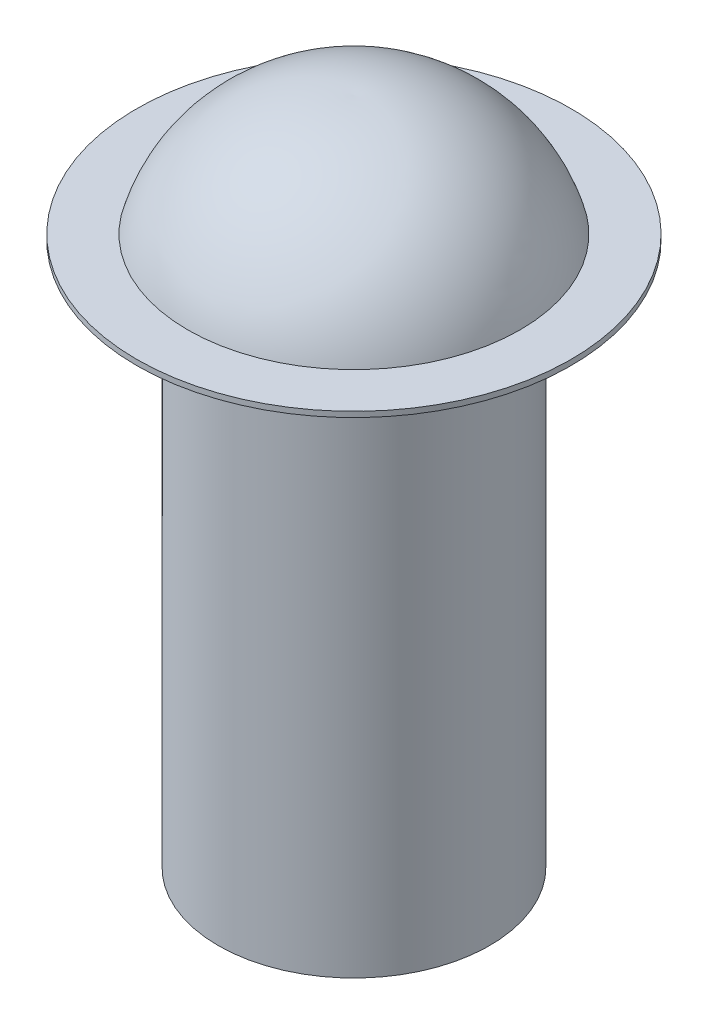
ISO-10303-21;
HEADER;
FILE_DESCRIPTION(('STEP AP214'),'2;1');
FILE_NAME('part.step','',(''),(''),'','','');
FILE_SCHEMA(('AUTOMOTIVE_DESIGN { 1 0 10303 214 1 1 1 1 }'));
ENDSEC;
DATA;
#1=APPLICATION_CONTEXT('core data for automotive mechanical design processes');
#2=APPLICATION_PROTOCOL_DEFINITION('international standard','automotive_design',2000,#1);
#3=PRODUCT_CONTEXT('',#1,'mechanical');
#4=PRODUCT('Part','Part','',(#3));
#5=PRODUCT_RELATED_PRODUCT_CATEGORY('part','',(#4));
#6=PRODUCT_DEFINITION_FORMATION('','',#4);
#7=PRODUCT_DEFINITION_CONTEXT('part definition',#1,'design');
#8=PRODUCT_DEFINITION('design','',#6,#7);
#9=PRODUCT_DEFINITION_SHAPE('','',#8);
#10=(LENGTH_UNIT() NAMED_UNIT(*) SI_UNIT(.MILLI.,.METRE.));
#11=(NAMED_UNIT(*) PLANE_ANGLE_UNIT() SI_UNIT($,.RADIAN.));
#12=(NAMED_UNIT(*) SI_UNIT($,.STERADIAN.) SOLID_ANGLE_UNIT());
#13=UNCERTAINTY_MEASURE_WITH_UNIT(LENGTH_MEASURE(1.E-05),#10,'distance_accuracy_value','');
#14=(GEOMETRIC_REPRESENTATION_CONTEXT(3) GLOBAL_UNCERTAINTY_ASSIGNED_CONTEXT((#13)) GLOBAL_UNIT_ASSIGNED_CONTEXT((#10,
#11,#12)) REPRESENTATION_CONTEXT('',''));
#15=CARTESIAN_POINT('',(0.,0.,0.));
#16=DIRECTION('',(0.,0.,1.));
#17=DIRECTION('',(1.,0.,0.));
#18=AXIS2_PLACEMENT_3D('',#15,#16,#17);
#19=CARTESIAN_POINT('',(0.,12.7,0.));
#20=DIRECTION('',(0.,-1.,0.));
#21=DIRECTION('',(0.,0.,-1.));
#22=AXIS2_PLACEMENT_3D('',#19,#20,#21);
#23=CYLINDRICAL_SURFACE('',#22,3.175);
#24=CARTESIAN_POINT('',(0.,12.7,0.));
#25=DIRECTION('',(0.,1.,0.));
#26=DIRECTION('',(0.,0.,1.));
#27=AXIS2_PLACEMENT_3D('',#24,#25,#26);
#28=CIRCLE('',#27,3.175);
#29=CARTESIAN_POINT('',(0.,12.7,3.175));
#30=VERTEX_POINT('',#29);
#31=EDGE_CURVE('E11',#30,#30,#28,.T.);
#32=ORIENTED_EDGE('',*,*,#31,.F.);
#33=EDGE_LOOP('',(#32));
#34=FACE_BOUND('',#33,.T.);
#35=CARTESIAN_POINT('',(0.,0.,0.));
#36=DIRECTION('',(0.,1.,0.));
#37=DIRECTION('',(0.,0.,1.));
#38=AXIS2_PLACEMENT_3D('',#35,#36,#37);
#39=CIRCLE('',#38,3.175);
#40=CARTESIAN_POINT('',(0.,0.,3.175));
#41=VERTEX_POINT('',#40);
#42=EDGE_CURVE('E36',#41,#41,#39,.T.);
#43=ORIENTED_EDGE('',*,*,#42,.T.);
#44=EDGE_LOOP('',(#43));
#45=FACE_BOUND('',#44,.T.);
#46=ADVANCED_FACE('F33',(#34,#45),#23,.T.);
#47=CARTESIAN_POINT('',(0.,0.,0.));
#48=DIRECTION('',(0.,1.,0.));
#49=DIRECTION('',(0.,0.,1.));
#50=AXIS2_PLACEMENT_3D('',#47,#48,#49);
#51=PLANE('',#50);
#52=ORIENTED_EDGE('',*,*,#42,.F.);
#53=EDGE_LOOP('',(#52));
#54=FACE_BOUND('',#53,.T.);
#55=ADVANCED_FACE('F56',(#54),#51,.F.);
#56=CARTESIAN_POINT('',(0.,12.827,0.));
#57=DIRECTION('',(0.,-1.,0.));
#58=DIRECTION('',(0.,0.,-1.));
#59=AXIS2_PLACEMENT_3D('',#56,#57,#58);
#60=CYLINDRICAL_SURFACE('',#59,5.08);
#61=CARTESIAN_POINT('',(0.,12.827,0.));
#62=DIRECTION('',(0.,1.,0.));
#63=DIRECTION('',(0.,0.,1.));
#64=AXIS2_PLACEMENT_3D('',#61,#62,#63);
#65=CIRCLE('',#64,5.08);
#66=CARTESIAN_POINT('',(0.,12.827,5.08));
#67=VERTEX_POINT('',#66);
#68=EDGE_CURVE('E67',#67,#67,#65,.T.);
#69=ORIENTED_EDGE('',*,*,#68,.F.);
#70=EDGE_LOOP('',(#69));
#71=FACE_BOUND('',#70,.T.);
#72=CARTESIAN_POINT('',(0.,12.7,0.));
#73=DIRECTION('',(0.,1.,0.));
#74=DIRECTION('',(0.,0.,1.));
#75=AXIS2_PLACEMENT_3D('',#72,#73,#74);
#76=CIRCLE('',#75,5.08);
#77=CARTESIAN_POINT('',(0.,12.7,5.08));
#78=VERTEX_POINT('',#77);
#79=EDGE_CURVE('E69',#78,#78,#76,.T.);
#80=ORIENTED_EDGE('',*,*,#79,.T.);
#81=EDGE_LOOP('',(#80));
#82=FACE_BOUND('',#81,.T.);
#83=ADVANCED_FACE('F61',(#71,#82),#60,.T.);
#84=CARTESIAN_POINT('',(0.,12.827,0.));
#85=DIRECTION('',(0.,1.,0.));
#86=DIRECTION('',(0.,0.,1.));
#87=AXIS2_PLACEMENT_3D('',#84,#85,#86);
#88=PLANE('',#87);
#89=CARTESIAN_POINT('',(0.,12.827,0.));
#90=DIRECTION('',(0.,-1.,0.));
#91=DIRECTION('',(0.,0.,-1.));
#92=AXIS2_PLACEMENT_3D('',#89,#90,#91);
#93=CIRCLE('',#92,3.88632923932564);
#94=CARTESIAN_POINT('',(0.,12.827,-3.88632923932564));
#95=VERTEX_POINT('',#94);
#96=EDGE_CURVE('E74',#95,#95,#93,.T.);
#97=ORIENTED_EDGE('',*,*,#96,.T.);
#98=EDGE_LOOP('',(#97));
#99=FACE_BOUND('',#98,.T.);
#100=ORIENTED_EDGE('',*,*,#68,.T.);
#101=EDGE_LOOP('',(#100));
#102=FACE_BOUND('',#101,.T.);
#103=ADVANCED_FACE('F50',(#99,#102),#88,.T.);
#104=CARTESIAN_POINT('',(0.,12.7,0.));
#105=DIRECTION('',(0.,1.,0.));
#106=DIRECTION('',(0.,0.,1.));
#107=AXIS2_PLACEMENT_3D('',#104,#105,#106);
#108=PLANE('',#107);
#109=ORIENTED_EDGE('',*,*,#31,.T.);
#110=EDGE_LOOP('',(#109));
#111=FACE_BOUND('',#110,.T.);
#112=ORIENTED_EDGE('',*,*,#79,.F.);
#113=EDGE_LOOP('',(#112));
#114=FACE_BOUND('',#113,.T.);
#115=ADVANCED_FACE('F44',(#111,#114),#108,.F.);
#116=CARTESIAN_POINT('',(0.,11.7893707464386,-0.166551769304525));
#117=DIRECTION('',(-1.,0.,0.));
#118=DIRECTION('',(0.,0.,-1.));
#119=AXIS2_PLACEMENT_3D('',#116,#117,#118);
#120=CIRCLE('',#119,3.86178959736584);
#121=TRIMMED_CURVE('',#120,(PARAMETER_VALUE(-1.61393783940422)),
(PARAMETER_VALUE(1.61393783940422)),.T.,.PARAMETER.);
#122=CARTESIAN_POINT('',(0.,11.7893707464386,0.));
#123=DIRECTION('',(0.,-1.,0.));
#124=AXIS1_PLACEMENT('',#122,#123);
#125=SURFACE_OF_REVOLUTION('',#121,#124);
#126=ORIENTED_EDGE('',*,*,#96,.F.);
#127=EDGE_LOOP('',(#126));
#128=FACE_BOUND('',#127,.T.);
#129=CARTESIAN_POINT('',(0.,15.6475671388563,0.));
#130=VERTEX_POINT('',#129);
#131=VERTEX_LOOP('',#130);
#132=FACE_BOUND('',#131,.T.);
#133=ADVANCED_FACE('F42',(#128,#132),#125,.T.);
#134=CLOSED_SHELL('',(#46,#55,#83,#103,#115,#133));
#135=MANIFOLD_SOLID_BREP('B2',#134);
#136=ADVANCED_BREP_SHAPE_REPRESENTATION('',(#18,#135),#14);
#137=SHAPE_DEFINITION_REPRESENTATION(#9,#136);
ENDSEC;
END-ISO-10303-21;
